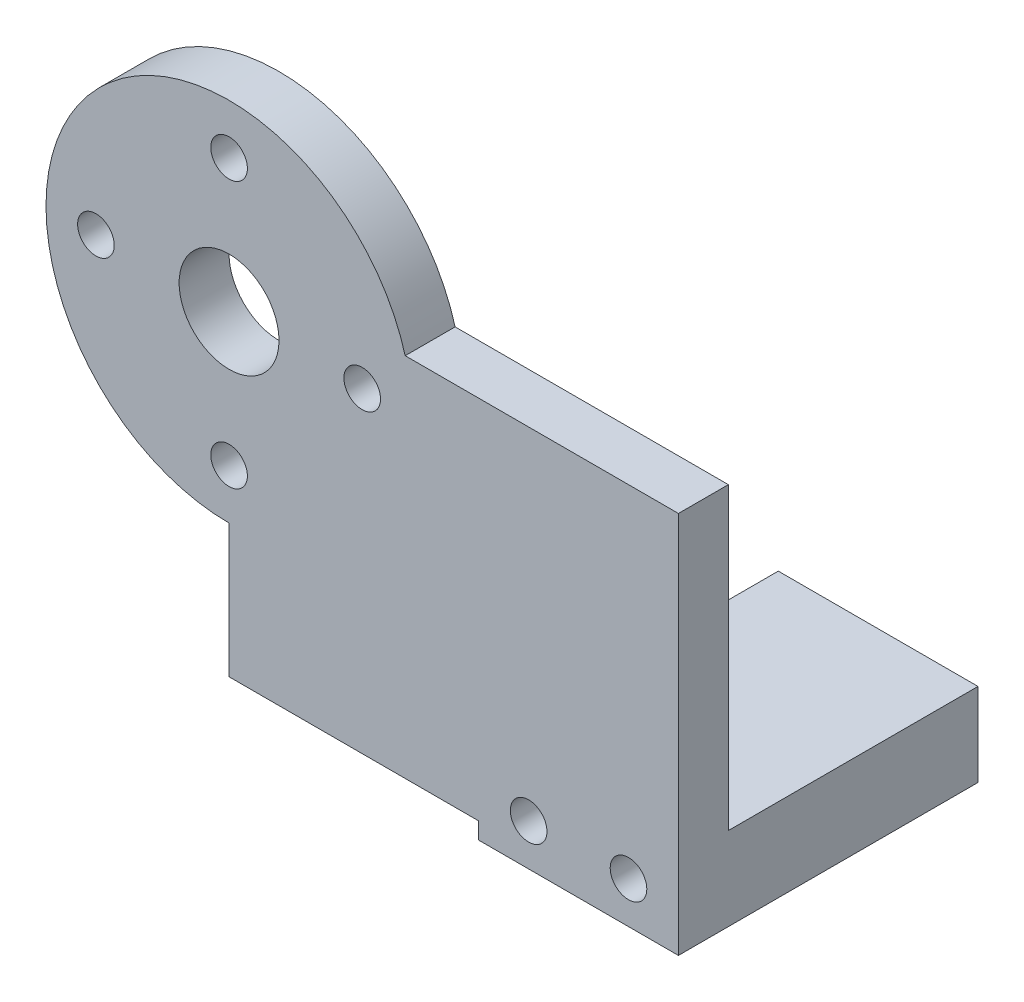
ISO-10303-21;
HEADER;
FILE_DESCRIPTION(('STEP AP214'),'2;1');
FILE_NAME('part.step','',(''),(''),'','','');
FILE_SCHEMA(('AUTOMOTIVE_DESIGN { 1 0 10303 214 1 1 1 1 }'));
ENDSEC;
DATA;
#1=APPLICATION_CONTEXT('core data for automotive mechanical design processes');
#2=APPLICATION_PROTOCOL_DEFINITION('international standard','automotive_design',2000,#1);
#3=PRODUCT_CONTEXT('',#1,'mechanical');
#4=PRODUCT('Part','Part','',(#3));
#5=PRODUCT_RELATED_PRODUCT_CATEGORY('part','',(#4));
#6=PRODUCT_DEFINITION_FORMATION('','',#4);
#7=PRODUCT_DEFINITION_CONTEXT('part definition',#1,'design');
#8=PRODUCT_DEFINITION('design','',#6,#7);
#9=PRODUCT_DEFINITION_SHAPE('','',#8);
#10=(LENGTH_UNIT() NAMED_UNIT(*) SI_UNIT(.MILLI.,.METRE.));
#11=(NAMED_UNIT(*) PLANE_ANGLE_UNIT() SI_UNIT($,.RADIAN.));
#12=(NAMED_UNIT(*) SI_UNIT($,.STERADIAN.) SOLID_ANGLE_UNIT());
#13=UNCERTAINTY_MEASURE_WITH_UNIT(LENGTH_MEASURE(1.E-05),#10,'distance_accuracy_value','');
#14=(GEOMETRIC_REPRESENTATION_CONTEXT(3) GLOBAL_UNCERTAINTY_ASSIGNED_CONTEXT((#13)) GLOBAL_UNIT_ASSIGNED_CONTEXT((#10,
#11,#12)) REPRESENTATION_CONTEXT('',''));
#15=CARTESIAN_POINT('',(0.,0.,0.));
#16=DIRECTION('',(0.,0.,1.));
#17=DIRECTION('',(1.,0.,0.));
#18=AXIS2_PLACEMENT_3D('',#15,#16,#17);
#19=CARTESIAN_POINT('',(0.,0.,15.));
#20=DIRECTION('',(0.,0.,1.));
#21=DIRECTION('',(1.,0.,0.));
#22=AXIS2_PLACEMENT_3D('',#19,#20,#21);
#23=PLANE('',#22);
#24=CARTESIAN_POINT('',(0.,-8.,15.));
#25=DIRECTION('',(0.,0.,1.));
#26=DIRECTION('',(1.,0.,0.));
#27=AXIS2_PLACEMENT_3D('',#24,#25,#26);
#28=CIRCLE('',#27,1.1);
#29=CARTESIAN_POINT('',(1.1,-8.,15.));
#30=VERTEX_POINT('',#29);
#31=EDGE_CURVE('E246',#30,#30,#28,.F.);
#32=ORIENTED_EDGE('',*,*,#31,.F.);
#33=EDGE_LOOP('',(#32));
#34=FACE_BOUND('',#33,.T.);
#35=CARTESIAN_POINT('',(0.,8.,15.));
#36=DIRECTION('',(0.,0.,1.));
#37=DIRECTION('',(1.,0.,0.));
#38=AXIS2_PLACEMENT_3D('',#35,#36,#37);
#39=CIRCLE('',#38,1.1);
#40=CARTESIAN_POINT('',(1.1,8.,15.));
#41=VERTEX_POINT('',#40);
#42=EDGE_CURVE('E245',#41,#41,#39,.F.);
#43=ORIENTED_EDGE('',*,*,#42,.F.);
#44=EDGE_LOOP('',(#43));
#45=FACE_BOUND('',#44,.T.);
#46=CARTESIAN_POINT('',(-8.,0.,15.));
#47=DIRECTION('',(0.,0.,1.));
#48=DIRECTION('',(1.,0.,0.));
#49=AXIS2_PLACEMENT_3D('',#46,#47,#48);
#50=CIRCLE('',#49,1.1);
#51=CARTESIAN_POINT('',(-6.9,0.,15.));
#52=VERTEX_POINT('',#51);
#53=EDGE_CURVE('E239',#52,#52,#50,.F.);
#54=ORIENTED_EDGE('',*,*,#53,.F.);
#55=EDGE_LOOP('',(#54));
#56=FACE_BOUND('',#55,.T.);
#57=CARTESIAN_POINT('',(8.,0.,15.));
#58=DIRECTION('',(0.,0.,1.));
#59=DIRECTION('',(1.,0.,0.));
#60=AXIS2_PLACEMENT_3D('',#57,#58,#59);
#61=CIRCLE('',#60,1.1);
#62=CARTESIAN_POINT('',(9.1,0.,15.));
#63=VERTEX_POINT('',#62);
#64=EDGE_CURVE('E221',#63,#63,#61,.F.);
#65=ORIENTED_EDGE('',*,*,#64,.F.);
#66=EDGE_LOOP('',(#65));
#67=FACE_BOUND('',#66,.T.);
#68=CARTESIAN_POINT('',(0.,0.,15.));
#69=DIRECTION('',(0.,0.,1.));
#70=DIRECTION('',(1.,0.,0.));
#71=AXIS2_PLACEMENT_3D('',#68,#69,#70);
#72=CIRCLE('',#71,3.);
#73=CARTESIAN_POINT('',(3.,0.,15.));
#74=VERTEX_POINT('',#73);
#75=EDGE_CURVE('E254',#74,#74,#72,.F.);
#76=ORIENTED_EDGE('',*,*,#75,.F.);
#77=EDGE_LOOP('',(#76));
#78=FACE_BOUND('',#77,.T.);
#79=DIRECTION('',(0.,1.,0.));
#80=VECTOR('',#79,1.);
#81=CARTESIAN_POINT('',(15.,0.,15.));
#82=LINE('',#81,#80);
#83=CARTESIAN_POINT('',(15.,-19.,15.));
#84=VERTEX_POINT('',#83);
#85=CARTESIAN_POINT('',(15.,-15.,15.));
#86=VERTEX_POINT('',#85);
#87=EDGE_CURVE('E145',#84,#86,#82,.T.);
#88=ORIENTED_EDGE('',*,*,#87,.F.);
#89=DIRECTION('',(1.,0.,0.));
#90=VECTOR('',#89,1.);
#91=CARTESIAN_POINT('',(0.,-19.,15.));
#92=LINE('',#91,#90);
#93=CARTESIAN_POINT('',(0.,-19.,15.));
#94=VERTEX_POINT('',#93);
#95=EDGE_CURVE('E168',#94,#84,#92,.T.);
#96=ORIENTED_EDGE('',*,*,#95,.F.);
#97=DIRECTION('',(0.,-1.,0.));
#98=VECTOR('',#97,1.);
#99=CARTESIAN_POINT('',(0.,-19.,15.));
#100=LINE('',#99,#98);
#101=CARTESIAN_POINT('',(0.,-11.,15.));
#102=VERTEX_POINT('',#101);
#103=EDGE_CURVE('E146',#102,#94,#100,.T.);
#104=ORIENTED_EDGE('',*,*,#103,.F.);
#105=CARTESIAN_POINT('',(0.,0.,15.));
#106=DIRECTION('',(0.,0.,1.));
#107=DIRECTION('',(1.,0.,0.));
#108=AXIS2_PLACEMENT_3D('',#105,#106,#107);
#109=CIRCLE('',#108,11.);
#110=CARTESIAN_POINT('',(10.5830052442584,3.,15.));
#111=VERTEX_POINT('',#110);
#112=EDGE_CURVE('E188',#111,#102,#109,.T.);
#113=ORIENTED_EDGE('',*,*,#112,.F.);
#114=DIRECTION('',(-1.,0.,0.));
#115=VECTOR('',#114,1.);
#116=CARTESIAN_POINT('',(0.,3.,15.));
#117=LINE('',#116,#115);
#118=CARTESIAN_POINT('',(27.,3.,15.));
#119=VERTEX_POINT('',#118);
#120=EDGE_CURVE('E160',#119,#111,#117,.T.);
#121=ORIENTED_EDGE('',*,*,#120,.F.);
#122=DIRECTION('',(0.,1.,0.));
#123=VECTOR('',#122,1.);
#124=CARTESIAN_POINT('',(27.,-19.,15.));
#125=LINE('',#124,#123);
#126=CARTESIAN_POINT('',(27.,-15.,15.));
#127=VERTEX_POINT('',#126);
#128=EDGE_CURVE('E69',#127,#119,#125,.T.);
#129=ORIENTED_EDGE('',*,*,#128,.F.);
#130=DIRECTION('',(1.,0.,0.));
#131=VECTOR('',#130,1.);
#132=CARTESIAN_POINT('',(0.,-15.,15.));
#133=LINE('',#132,#131);
#134=EDGE_CURVE('E11',#86,#127,#133,.T.);
#135=ORIENTED_EDGE('',*,*,#134,.F.);
#136=EDGE_LOOP('',(#88,#96,#104,#113,#121,#129,#135));
#137=FACE_BOUND('',#136,.T.);
#138=ADVANCED_FACE('F44',(#34,#45,#56,#67,#78,#137),#23,.F.);
#139=CARTESIAN_POINT('',(0.,-19.,18.));
#140=DIRECTION('',(0.,1.,0.));
#141=DIRECTION('',(0.,0.,1.));
#142=AXIS2_PLACEMENT_3D('',#139,#140,#141);
#143=PLANE('',#142);
#144=DIRECTION('',(0.,0.,-1.));
#145=VECTOR('',#144,1.);
#146=CARTESIAN_POINT('',(15.,-19.,18.));
#147=LINE('',#146,#145);
#148=CARTESIAN_POINT('',(15.,-19.,18.));
#149=VERTEX_POINT('',#148);
#150=EDGE_CURVE('E54',#149,#84,#147,.T.);
#151=ORIENTED_EDGE('',*,*,#150,.F.);
#152=DIRECTION('',(1.,0.,0.));
#153=VECTOR('',#152,1.);
#154=CARTESIAN_POINT('',(0.,-19.,18.));
#155=LINE('',#154,#153);
#156=CARTESIAN_POINT('',(0.,-19.,18.));
#157=VERTEX_POINT('',#156);
#158=EDGE_CURVE('E125',#157,#149,#155,.T.);
#159=ORIENTED_EDGE('',*,*,#158,.F.);
#160=DIRECTION('',(0.,0.,-1.));
#161=VECTOR('',#160,1.);
#162=CARTESIAN_POINT('',(0.,-19.,18.));
#163=LINE('',#162,#161);
#164=EDGE_CURVE('E182',#157,#94,#163,.T.);
#165=ORIENTED_EDGE('',*,*,#164,.T.);
#166=ORIENTED_EDGE('',*,*,#95,.T.);
#167=EDGE_LOOP('',(#151,#159,#165,#166));
#168=FACE_BOUND('',#167,.T.);
#169=ADVANCED_FACE('F298',(#168),#143,.F.);
#170=CARTESIAN_POINT('',(0.,0.,18.));
#171=DIRECTION('',(0.,0.,-1.));
#172=DIRECTION('',(-1.,0.,0.));
#173=AXIS2_PLACEMENT_3D('',#170,#171,#172);
#174=CYLINDRICAL_SURFACE('',#173,11.);
#175=DIRECTION('',(0.,0.,-1.));
#176=VECTOR('',#175,1.);
#177=CARTESIAN_POINT('',(0.,-11.,18.));
#178=LINE('',#177,#176);
#179=CARTESIAN_POINT('',(0.,-11.,18.));
#180=VERTEX_POINT('',#179);
#181=EDGE_CURVE('E193',#180,#102,#178,.T.);
#182=ORIENTED_EDGE('',*,*,#181,.F.);
#183=CARTESIAN_POINT('',(0.,0.,18.));
#184=DIRECTION('',(0.,0.,1.));
#185=DIRECTION('',(1.,0.,0.));
#186=AXIS2_PLACEMENT_3D('',#183,#184,#185);
#187=CIRCLE('',#186,11.);
#188=CARTESIAN_POINT('',(10.5830052442584,3.,18.));
#189=VERTEX_POINT('',#188);
#190=EDGE_CURVE('E187',#189,#180,#187,.T.);
#191=ORIENTED_EDGE('',*,*,#190,.F.);
#192=DIRECTION('',(0.,0.,-1.));
#193=VECTOR('',#192,1.);
#194=CARTESIAN_POINT('',(10.5830052442584,3.,18.));
#195=LINE('',#194,#193);
#196=EDGE_CURVE('E183',#111,#189,#195,.F.);
#197=ORIENTED_EDGE('',*,*,#196,.F.);
#198=ORIENTED_EDGE('',*,*,#112,.T.);
#199=EDGE_LOOP('',(#182,#191,#197,#198));
#200=FACE_BOUND('',#199,.T.);
#201=ADVANCED_FACE('F50',(#200),#174,.T.);
#202=CARTESIAN_POINT('',(0.,0.,18.));
#203=DIRECTION('',(0.,0.,1.));
#204=DIRECTION('',(1.,0.,0.));
#205=AXIS2_PLACEMENT_3D('',#202,#203,#204);
#206=PLANE('',#205);
#207=CARTESIAN_POINT('',(18.,-17.5,18.));
#208=DIRECTION('',(0.,0.,1.));
#209=DIRECTION('',(1.,0.,0.));
#210=AXIS2_PLACEMENT_3D('',#207,#208,#209);
#211=CIRCLE('',#210,1.1);
#212=CARTESIAN_POINT('',(19.1,-17.5,18.));
#213=VERTEX_POINT('',#212);
#214=EDGE_CURVE('E204',#213,#213,#211,.T.);
#215=ORIENTED_EDGE('',*,*,#214,.F.);
#216=EDGE_LOOP('',(#215));
#217=FACE_BOUND('',#216,.T.);
#218=CARTESIAN_POINT('',(24.,-17.5,18.));
#219=DIRECTION('',(0.,0.,1.));
#220=DIRECTION('',(1.,0.,0.));
#221=AXIS2_PLACEMENT_3D('',#218,#219,#220);
#222=CIRCLE('',#221,1.1);
#223=CARTESIAN_POINT('',(25.1,-17.5,18.));
#224=VERTEX_POINT('',#223);
#225=EDGE_CURVE('E215',#224,#224,#222,.T.);
#226=ORIENTED_EDGE('',*,*,#225,.F.);
#227=EDGE_LOOP('',(#226));
#228=FACE_BOUND('',#227,.T.);
#229=CARTESIAN_POINT('',(0.,-8.,18.));
#230=DIRECTION('',(0.,0.,1.));
#231=DIRECTION('',(1.,0.,0.));
#232=AXIS2_PLACEMENT_3D('',#229,#230,#231);
#233=CIRCLE('',#232,1.1);
#234=CARTESIAN_POINT('',(1.1,-8.,18.));
#235=VERTEX_POINT('',#234);
#236=EDGE_CURVE('E219',#235,#235,#233,.T.);
#237=ORIENTED_EDGE('',*,*,#236,.F.);
#238=EDGE_LOOP('',(#237));
#239=FACE_BOUND('',#238,.T.);
#240=CARTESIAN_POINT('',(0.,8.,18.));
#241=DIRECTION('',(0.,0.,1.));
#242=DIRECTION('',(1.,0.,0.));
#243=AXIS2_PLACEMENT_3D('',#240,#241,#242);
#244=CIRCLE('',#243,1.1);
#245=CARTESIAN_POINT('',(1.1,8.,18.));
#246=VERTEX_POINT('',#245);
#247=EDGE_CURVE('E223',#246,#246,#244,.T.);
#248=ORIENTED_EDGE('',*,*,#247,.F.);
#249=EDGE_LOOP('',(#248));
#250=FACE_BOUND('',#249,.T.);
#251=CARTESIAN_POINT('',(-8.,0.,18.));
#252=DIRECTION('',(0.,0.,1.));
#253=DIRECTION('',(1.,0.,0.));
#254=AXIS2_PLACEMENT_3D('',#251,#252,#253);
#255=CIRCLE('',#254,1.1);
#256=CARTESIAN_POINT('',(-6.9,0.,18.));
#257=VERTEX_POINT('',#256);
#258=EDGE_CURVE('E228',#257,#257,#255,.T.);
#259=ORIENTED_EDGE('',*,*,#258,.F.);
#260=EDGE_LOOP('',(#259));
#261=FACE_BOUND('',#260,.T.);
#262=CARTESIAN_POINT('',(8.,0.,18.));
#263=DIRECTION('',(0.,0.,1.));
#264=DIRECTION('',(1.,0.,0.));
#265=AXIS2_PLACEMENT_3D('',#262,#263,#264);
#266=CIRCLE('',#265,1.1);
#267=CARTESIAN_POINT('',(9.1,0.,18.));
#268=VERTEX_POINT('',#267);
#269=EDGE_CURVE('E209',#268,#268,#266,.T.);
#270=ORIENTED_EDGE('',*,*,#269,.F.);
#271=EDGE_LOOP('',(#270));
#272=FACE_BOUND('',#271,.T.);
#273=CARTESIAN_POINT('',(0.,0.,18.));
#274=DIRECTION('',(0.,0.,1.));
#275=DIRECTION('',(1.,0.,0.));
#276=AXIS2_PLACEMENT_3D('',#273,#274,#275);
#277=CIRCLE('',#276,3.);
#278=CARTESIAN_POINT('',(3.,0.,18.));
#279=VERTEX_POINT('',#278);
#280=EDGE_CURVE('E253',#279,#279,#277,.T.);
#281=ORIENTED_EDGE('',*,*,#280,.F.);
#282=EDGE_LOOP('',(#281));
#283=FACE_BOUND('',#282,.T.);
#284=ORIENTED_EDGE('',*,*,#158,.T.);
#285=DIRECTION('',(0.,-1.,0.));
#286=VECTOR('',#285,1.);
#287=CARTESIAN_POINT('',(15.,-20.,18.));
#288=LINE('',#287,#286);
#289=CARTESIAN_POINT('',(15.,-20.,18.));
#290=VERTEX_POINT('',#289);
#291=EDGE_CURVE('E116',#149,#290,#288,.T.);
#292=ORIENTED_EDGE('',*,*,#291,.T.);
#293=DIRECTION('',(1.,0.,0.));
#294=VECTOR('',#293,1.);
#295=CARTESIAN_POINT('',(15.,-20.,18.));
#296=LINE('',#295,#294);
#297=CARTESIAN_POINT('',(27.,-20.,18.));
#298=VERTEX_POINT('',#297);
#299=EDGE_CURVE('E117',#290,#298,#296,.T.);
#300=ORIENTED_EDGE('',*,*,#299,.T.);
#301=DIRECTION('',(0.,1.,0.));
#302=VECTOR('',#301,1.);
#303=CARTESIAN_POINT('',(27.,-19.,18.));
#304=LINE('',#303,#302);
#305=CARTESIAN_POINT('',(27.,3.,18.));
#306=VERTEX_POINT('',#305);
#307=EDGE_CURVE('E159',#298,#306,#304,.T.);
#308=ORIENTED_EDGE('',*,*,#307,.T.);
#309=DIRECTION('',(-1.,0.,0.));
#310=VECTOR('',#309,1.);
#311=CARTESIAN_POINT('',(0.,3.,18.));
#312=LINE('',#311,#310);
#313=EDGE_CURVE('E162',#306,#189,#312,.T.);
#314=ORIENTED_EDGE('',*,*,#313,.T.);
#315=ORIENTED_EDGE('',*,*,#190,.T.);
#316=DIRECTION('',(0.,-1.,0.));
#317=VECTOR('',#316,1.);
#318=CARTESIAN_POINT('',(0.,-19.,18.));
#319=LINE('',#318,#317);
#320=EDGE_CURVE('E152',#180,#157,#319,.T.);
#321=ORIENTED_EDGE('',*,*,#320,.T.);
#322=EDGE_LOOP('',(#284,#292,#300,#308,#314,#315,#321));
#323=FACE_BOUND('',#322,.T.);
#324=ADVANCED_FACE('F118',(#217,#228,#239,#250,#261,#272,#283,#323),#206,.T.);
#325=CARTESIAN_POINT('',(0.,-19.,18.));
#326=DIRECTION('',(1.,0.,0.));
#327=DIRECTION('',(0.,0.,-1.));
#328=AXIS2_PLACEMENT_3D('',#325,#326,#327);
#329=PLANE('',#328);
#330=ORIENTED_EDGE('',*,*,#320,.F.);
#331=ORIENTED_EDGE('',*,*,#181,.T.);
#332=ORIENTED_EDGE('',*,*,#103,.T.);
#333=ORIENTED_EDGE('',*,*,#164,.F.);
#334=EDGE_LOOP('',(#330,#331,#332,#333));
#335=FACE_BOUND('',#334,.T.);
#336=ADVANCED_FACE('F313',(#335),#329,.F.);
#337=CARTESIAN_POINT('',(0.,3.,18.));
#338=DIRECTION('',(0.,-1.,0.));
#339=DIRECTION('',(0.,0.,-1.));
#340=AXIS2_PLACEMENT_3D('',#337,#338,#339);
#341=PLANE('',#340);
#342=ORIENTED_EDGE('',*,*,#120,.T.);
#343=ORIENTED_EDGE('',*,*,#196,.T.);
#344=ORIENTED_EDGE('',*,*,#313,.F.);
#345=DIRECTION('',(0.,0.,-1.));
#346=VECTOR('',#345,1.);
#347=CARTESIAN_POINT('',(27.,3.,18.));
#348=LINE('',#347,#346);
#349=EDGE_CURVE('E170',#306,#119,#348,.T.);
#350=ORIENTED_EDGE('',*,*,#349,.T.);
#351=EDGE_LOOP('',(#342,#343,#344,#350));
#352=FACE_BOUND('',#351,.T.);
#353=ADVANCED_FACE('F314',(#352),#341,.F.);
#354=CARTESIAN_POINT('',(27.,-19.,18.));
#355=DIRECTION('',(-1.,0.,0.));
#356=DIRECTION('',(0.,0.,1.));
#357=AXIS2_PLACEMENT_3D('',#354,#355,#356);
#358=PLANE('',#357);
#359=DIRECTION('',(0.,0.,-1.));
#360=VECTOR('',#359,1.);
#361=CARTESIAN_POINT('',(27.,-15.,18.));
#362=LINE('',#361,#360);
#363=CARTESIAN_POINT('',(27.,-15.,0.));
#364=VERTEX_POINT('',#363);
#365=EDGE_CURVE('E147',#127,#364,#362,.T.);
#366=ORIENTED_EDGE('',*,*,#365,.F.);
#367=ORIENTED_EDGE('',*,*,#128,.T.);
#368=ORIENTED_EDGE('',*,*,#349,.F.);
#369=ORIENTED_EDGE('',*,*,#307,.F.);
#370=DIRECTION('',(0.,0.,-1.));
#371=VECTOR('',#370,1.);
#372=CARTESIAN_POINT('',(27.,-20.,18.));
#373=LINE('',#372,#371);
#374=CARTESIAN_POINT('',(27.,-20.,0.));
#375=VERTEX_POINT('',#374);
#376=EDGE_CURVE('E139',#298,#375,#373,.T.);
#377=ORIENTED_EDGE('',*,*,#376,.T.);
#378=DIRECTION('',(0.,1.,0.));
#379=VECTOR('',#378,1.);
#380=CARTESIAN_POINT('',(27.,-20.,0.));
#381=LINE('',#380,#379);
#382=EDGE_CURVE('E262',#375,#364,#381,.T.);
#383=ORIENTED_EDGE('',*,*,#382,.T.);
#384=EDGE_LOOP('',(#366,#367,#368,#369,#377,#383));
#385=FACE_BOUND('',#384,.T.);
#386=ADVANCED_FACE('F278',(#385),#358,.F.);
#387=CARTESIAN_POINT('',(15.,-15.,18.));
#388=DIRECTION('',(0.,-1.,0.));
#389=DIRECTION('',(0.,0.,-1.));
#390=AXIS2_PLACEMENT_3D('',#387,#388,#389);
#391=PLANE('',#390);
#392=DIRECTION('',(0.,0.,-1.));
#393=VECTOR('',#392,1.);
#394=CARTESIAN_POINT('',(15.,-15.,18.));
#395=LINE('',#394,#393);
#396=CARTESIAN_POINT('',(15.,-15.,0.));
#397=VERTEX_POINT('',#396);
#398=EDGE_CURVE('E140',#86,#397,#395,.T.);
#399=ORIENTED_EDGE('',*,*,#398,.F.);
#400=ORIENTED_EDGE('',*,*,#134,.T.);
#401=ORIENTED_EDGE('',*,*,#365,.T.);
#402=DIRECTION('',(-1.,0.,0.));
#403=VECTOR('',#402,1.);
#404=CARTESIAN_POINT('',(15.,-15.,0.));
#405=LINE('',#404,#403);
#406=EDGE_CURVE('E126',#364,#397,#405,.T.);
#407=ORIENTED_EDGE('',*,*,#406,.T.);
#408=EDGE_LOOP('',(#399,#400,#401,#407));
#409=FACE_BOUND('',#408,.T.);
#410=ADVANCED_FACE('F277',(#409),#391,.F.);
#411=CARTESIAN_POINT('',(15.,-20.,18.));
#412=DIRECTION('',(1.,0.,0.));
#413=DIRECTION('',(0.,0.,-1.));
#414=AXIS2_PLACEMENT_3D('',#411,#412,#413);
#415=PLANE('',#414);
#416=ORIENTED_EDGE('',*,*,#150,.T.);
#417=ORIENTED_EDGE('',*,*,#87,.T.);
#418=ORIENTED_EDGE('',*,*,#398,.T.);
#419=DIRECTION('',(0.,-1.,0.));
#420=VECTOR('',#419,1.);
#421=CARTESIAN_POINT('',(15.,-20.,0.));
#422=LINE('',#421,#420);
#423=CARTESIAN_POINT('',(15.,-20.,0.));
#424=VERTEX_POINT('',#423);
#425=EDGE_CURVE('E142',#397,#424,#422,.T.);
#426=ORIENTED_EDGE('',*,*,#425,.T.);
#427=DIRECTION('',(0.,0.,-1.));
#428=VECTOR('',#427,1.);
#429=CARTESIAN_POINT('',(15.,-20.,18.));
#430=LINE('',#429,#428);
#431=EDGE_CURVE('E135',#290,#424,#430,.T.);
#432=ORIENTED_EDGE('',*,*,#431,.F.);
#433=ORIENTED_EDGE('',*,*,#291,.F.);
#434=EDGE_LOOP('',(#416,#417,#418,#426,#432,#433));
#435=FACE_BOUND('',#434,.T.);
#436=ADVANCED_FACE('F137',(#435),#415,.F.);
#437=CARTESIAN_POINT('',(15.,-20.,18.));
#438=DIRECTION('',(0.,1.,0.));
#439=DIRECTION('',(0.,0.,1.));
#440=AXIS2_PLACEMENT_3D('',#437,#438,#439);
#441=PLANE('',#440);
#442=DIRECTION('',(1.,0.,0.));
#443=VECTOR('',#442,1.);
#444=CARTESIAN_POINT('',(15.,-20.,0.));
#445=LINE('',#444,#443);
#446=EDGE_CURVE('E261',#424,#375,#445,.T.);
#447=ORIENTED_EDGE('',*,*,#446,.T.);
#448=ORIENTED_EDGE('',*,*,#376,.F.);
#449=ORIENTED_EDGE('',*,*,#299,.F.);
#450=ORIENTED_EDGE('',*,*,#431,.T.);
#451=EDGE_LOOP('',(#447,#448,#449,#450));
#452=FACE_BOUND('',#451,.T.);
#453=ADVANCED_FACE('F131',(#452),#441,.F.);
#454=CARTESIAN_POINT('',(0.,0.,0.));
#455=DIRECTION('',(0.,0.,-1.));
#456=DIRECTION('',(-1.,0.,0.));
#457=AXIS2_PLACEMENT_3D('',#454,#455,#456);
#458=PLANE('',#457);
#459=CARTESIAN_POINT('',(18.,-17.5,0.));
#460=DIRECTION('',(0.,0.,-1.));
#461=DIRECTION('',(-1.,0.,0.));
#462=AXIS2_PLACEMENT_3D('',#459,#460,#461);
#463=CIRCLE('',#462,1.1);
#464=CARTESIAN_POINT('',(16.9,-17.5,0.));
#465=VERTEX_POINT('',#464);
#466=EDGE_CURVE('E47',#465,#465,#463,.F.);
#467=ORIENTED_EDGE('',*,*,#466,.T.);
#468=EDGE_LOOP('',(#467));
#469=FACE_BOUND('',#468,.T.);
#470=CARTESIAN_POINT('',(24.,-17.5,0.));
#471=DIRECTION('',(0.,0.,-1.));
#472=DIRECTION('',(-1.,0.,0.));
#473=AXIS2_PLACEMENT_3D('',#470,#471,#472);
#474=CIRCLE('',#473,1.1);
#475=CARTESIAN_POINT('',(22.9,-17.5,0.));
#476=VERTEX_POINT('',#475);
#477=EDGE_CURVE('E203',#476,#476,#474,.F.);
#478=ORIENTED_EDGE('',*,*,#477,.T.);
#479=EDGE_LOOP('',(#478));
#480=FACE_BOUND('',#479,.T.);
#481=ORIENTED_EDGE('',*,*,#425,.F.);
#482=ORIENTED_EDGE('',*,*,#406,.F.);
#483=ORIENTED_EDGE('',*,*,#382,.F.);
#484=ORIENTED_EDGE('',*,*,#446,.F.);
#485=EDGE_LOOP('',(#481,#482,#483,#484));
#486=FACE_BOUND('',#485,.T.);
#487=ADVANCED_FACE('F281',(#469,#480,#486),#458,.T.);
#488=CARTESIAN_POINT('',(0.,0.,18.));
#489=DIRECTION('',(0.,0.,-1.));
#490=DIRECTION('',(-1.,0.,0.));
#491=AXIS2_PLACEMENT_3D('',#488,#489,#490);
#492=CYLINDRICAL_SURFACE('',#491,3.);
#493=ORIENTED_EDGE('',*,*,#280,.T.);
#494=EDGE_LOOP('',(#493));
#495=FACE_BOUND('',#494,.T.);
#496=ORIENTED_EDGE('',*,*,#75,.T.);
#497=EDGE_LOOP('',(#496));
#498=FACE_BOUND('',#497,.T.);
#499=ADVANCED_FACE('F283',(#495,#498),#492,.F.);
#500=CARTESIAN_POINT('',(8.,0.,18.));
#501=DIRECTION('',(0.,0.,-1.));
#502=DIRECTION('',(-1.,0.,0.));
#503=AXIS2_PLACEMENT_3D('',#500,#501,#502);
#504=CYLINDRICAL_SURFACE('',#503,1.1);
#505=ORIENTED_EDGE('',*,*,#269,.T.);
#506=EDGE_LOOP('',(#505));
#507=FACE_BOUND('',#506,.T.);
#508=ORIENTED_EDGE('',*,*,#64,.T.);
#509=EDGE_LOOP('',(#508));
#510=FACE_BOUND('',#509,.T.);
#511=ADVANCED_FACE('F295',(#507,#510),#504,.F.);
#512=CARTESIAN_POINT('',(-8.,0.,18.));
#513=DIRECTION('',(0.,0.,-1.));
#514=DIRECTION('',(-1.,0.,0.));
#515=AXIS2_PLACEMENT_3D('',#512,#513,#514);
#516=CYLINDRICAL_SURFACE('',#515,1.1);
#517=ORIENTED_EDGE('',*,*,#258,.T.);
#518=EDGE_LOOP('',(#517));
#519=FACE_BOUND('',#518,.T.);
#520=ORIENTED_EDGE('',*,*,#53,.T.);
#521=EDGE_LOOP('',(#520));
#522=FACE_BOUND('',#521,.T.);
#523=ADVANCED_FACE('F352',(#519,#522),#516,.F.);
#524=CARTESIAN_POINT('',(0.,8.,18.));
#525=DIRECTION('',(0.,0.,-1.));
#526=DIRECTION('',(-1.,0.,0.));
#527=AXIS2_PLACEMENT_3D('',#524,#525,#526);
#528=CYLINDRICAL_SURFACE('',#527,1.1);
#529=ORIENTED_EDGE('',*,*,#247,.T.);
#530=EDGE_LOOP('',(#529));
#531=FACE_BOUND('',#530,.T.);
#532=ORIENTED_EDGE('',*,*,#42,.T.);
#533=EDGE_LOOP('',(#532));
#534=FACE_BOUND('',#533,.T.);
#535=ADVANCED_FACE('F364',(#531,#534),#528,.F.);
#536=CARTESIAN_POINT('',(0.,-8.,18.));
#537=DIRECTION('',(0.,0.,-1.));
#538=DIRECTION('',(-1.,0.,0.));
#539=AXIS2_PLACEMENT_3D('',#536,#537,#538);
#540=CYLINDRICAL_SURFACE('',#539,1.1);
#541=ORIENTED_EDGE('',*,*,#236,.T.);
#542=EDGE_LOOP('',(#541));
#543=FACE_BOUND('',#542,.T.);
#544=ORIENTED_EDGE('',*,*,#31,.T.);
#545=EDGE_LOOP('',(#544));
#546=FACE_BOUND('',#545,.T.);
#547=ADVANCED_FACE('F374',(#543,#546),#540,.F.);
#548=CARTESIAN_POINT('',(24.,-17.5,18.));
#549=DIRECTION('',(0.,0.,-1.));
#550=DIRECTION('',(-1.,0.,0.));
#551=AXIS2_PLACEMENT_3D('',#548,#549,#550);
#552=CYLINDRICAL_SURFACE('',#551,1.1);
#553=ORIENTED_EDGE('',*,*,#477,.F.);
#554=EDGE_LOOP('',(#553));
#555=FACE_BOUND('',#554,.T.);
#556=ORIENTED_EDGE('',*,*,#225,.T.);
#557=EDGE_LOOP('',(#556));
#558=FACE_BOUND('',#557,.T.);
#559=ADVANCED_FACE('F384',(#555,#558),#552,.F.);
#560=CARTESIAN_POINT('',(18.,-17.5,18.));
#561=DIRECTION('',(0.,0.,-1.));
#562=DIRECTION('',(-1.,0.,0.));
#563=AXIS2_PLACEMENT_3D('',#560,#561,#562);
#564=CYLINDRICAL_SURFACE('',#563,1.1);
#565=ORIENTED_EDGE('',*,*,#466,.F.);
#566=EDGE_LOOP('',(#565));
#567=FACE_BOUND('',#566,.T.);
#568=ORIENTED_EDGE('',*,*,#214,.T.);
#569=EDGE_LOOP('',(#568));
#570=FACE_BOUND('',#569,.T.);
#571=ADVANCED_FACE('F393',(#567,#570),#564,.F.);
#572=CLOSED_SHELL('',(#138,#169,#201,#324,#336,#353,#386,#410,#436,#453,#487,#499,#511,#523,
#535,#547,#559,#571));
#573=MANIFOLD_SOLID_BREP('B2',#572);
#574=ADVANCED_BREP_SHAPE_REPRESENTATION('',(#18,#573),#14);
#575=SHAPE_DEFINITION_REPRESENTATION(#9,#574);
ENDSEC;
END-ISO-10303-21;
